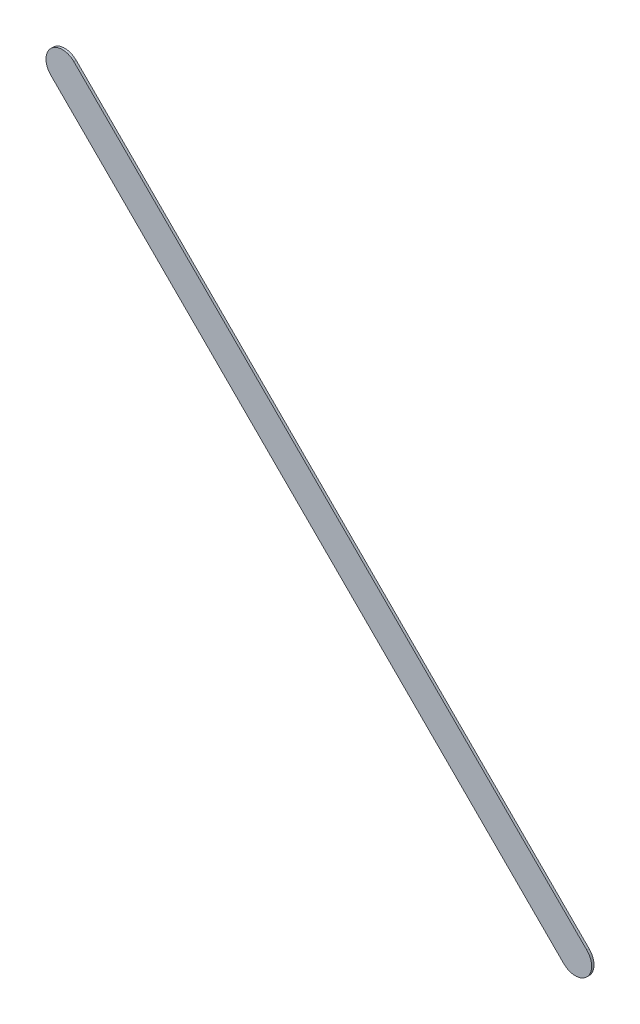
ISO-10303-21;
HEADER;
FILE_DESCRIPTION(('STEP AP214'),'2;1');
FILE_NAME('part.step','',(''),(''),'','','');
FILE_SCHEMA(('AUTOMOTIVE_DESIGN { 1 0 10303 214 1 1 1 1 }'));
ENDSEC;
DATA;
#1=APPLICATION_CONTEXT('core data for automotive mechanical design processes');
#2=APPLICATION_PROTOCOL_DEFINITION('international standard','automotive_design',2000,#1);
#3=PRODUCT_CONTEXT('',#1,'mechanical');
#4=PRODUCT('Part','Part','',(#3));
#5=PRODUCT_RELATED_PRODUCT_CATEGORY('part','',(#4));
#6=PRODUCT_DEFINITION_FORMATION('','',#4);
#7=PRODUCT_DEFINITION_CONTEXT('part definition',#1,'design');
#8=PRODUCT_DEFINITION('design','',#6,#7);
#9=PRODUCT_DEFINITION_SHAPE('','',#8);
#10=(LENGTH_UNIT() NAMED_UNIT(*) SI_UNIT(.MILLI.,.METRE.));
#11=(NAMED_UNIT(*) PLANE_ANGLE_UNIT() SI_UNIT($,.RADIAN.));
#12=(NAMED_UNIT(*) SI_UNIT($,.STERADIAN.) SOLID_ANGLE_UNIT());
#13=UNCERTAINTY_MEASURE_WITH_UNIT(LENGTH_MEASURE(1.E-05),#10,'distance_accuracy_value','');
#14=(GEOMETRIC_REPRESENTATION_CONTEXT(3) GLOBAL_UNCERTAINTY_ASSIGNED_CONTEXT((#13)) GLOBAL_UNIT_ASSIGNED_CONTEXT((#10,
#11,#12)) REPRESENTATION_CONTEXT('',''));
#15=CARTESIAN_POINT('',(0.,0.,0.));
#16=DIRECTION('',(0.,0.,1.));
#17=DIRECTION('',(1.,0.,0.));
#18=AXIS2_PLACEMENT_3D('',#15,#16,#17);
#19=CARTESIAN_POINT('',(62.39256762,82.15386922,0.));
#20=DIRECTION('',(0.707106781186548,0.707106781186547,0.));
#21=DIRECTION('',(0.707106781186547,-0.707106781186548,0.));
#22=AXIS2_PLACEMENT_3D('',#19,#20,#21);
#23=PLANE('',#22);
#24=DIRECTION('',(0.707106781186547,-0.707106781186548,0.));
#25=VECTOR('',#24,1.);
#26=CARTESIAN_POINT('',(62.39256762,82.15386922,0.03556));
#27=LINE('',#26,#25);
#28=CARTESIAN_POINT('',(62.39256762,82.15386922,0.03556));
#29=VERTEX_POINT('',#28);
#30=CARTESIAN_POINT('',(70.22322252,74.32321432,0.03556));
#31=VERTEX_POINT('',#30);
#32=EDGE_CURVE('E11',#29,#31,#27,.T.);
#33=ORIENTED_EDGE('',*,*,#32,.F.);
#34=DIRECTION('',(0.,0.,1.));
#35=VECTOR('',#34,1.);
#36=CARTESIAN_POINT('',(62.39256762,82.15386922,0.));
#37=LINE('',#36,#35);
#38=CARTESIAN_POINT('',(62.39256762,82.15386922,0.));
#39=VERTEX_POINT('',#38);
#40=EDGE_CURVE('E24',#39,#29,#37,.T.);
#41=ORIENTED_EDGE('',*,*,#40,.F.);
#42=DIRECTION('',(0.707106781186547,-0.707106781186548,0.));
#43=VECTOR('',#42,1.);
#44=CARTESIAN_POINT('',(62.39256762,82.15386922,0.));
#45=LINE('',#44,#43);
#46=CARTESIAN_POINT('',(70.22322252,74.32321432,0.));
#47=VERTEX_POINT('',#46);
#48=EDGE_CURVE('E75',#39,#47,#45,.T.);
#49=ORIENTED_EDGE('',*,*,#48,.T.);
#50=DIRECTION('',(0.,0.,1.));
#51=VECTOR('',#50,1.);
#52=CARTESIAN_POINT('',(70.22322252,74.32321432,0.));
#53=LINE('',#52,#51);
#54=EDGE_CURVE('E37',#47,#31,#53,.T.);
#55=ORIENTED_EDGE('',*,*,#54,.T.);
#56=EDGE_LOOP('',(#33,#41,#49,#55));
#57=FACE_BOUND('',#56,.T.);
#58=ADVANCED_FACE('F17',(#57),#23,.F.);
#59=CARTESIAN_POINT('',(70.3999989,74.4999907,0.));
#60=DIRECTION('',(0.,0.,-1.));
#61=DIRECTION('',(-0.707106781186576,-0.707106781186519,0.));
#62=AXIS2_PLACEMENT_3D('',#59,#60,#61);
#63=CYLINDRICAL_SURFACE('',#62,0.249999554103223);
#64=CARTESIAN_POINT('',(70.3999989,74.4999907,0.03556));
#65=DIRECTION('',(0.,0.,1.));
#66=DIRECTION('',(-0.707106781186576,-0.707106781186519,0.));
#67=AXIS2_PLACEMENT_3D('',#64,#65,#66);
#68=CIRCLE('',#67,0.249999554103223);
#69=CARTESIAN_POINT('',(70.57677528,74.67676708,0.03556));
#70=VERTEX_POINT('',#69);
#71=EDGE_CURVE('E83',#31,#70,#68,.T.);
#72=ORIENTED_EDGE('',*,*,#71,.F.);
#73=ORIENTED_EDGE('',*,*,#54,.F.);
#74=CARTESIAN_POINT('',(70.3999989,74.4999907,0.));
#75=DIRECTION('',(0.,0.,1.));
#76=DIRECTION('',(-0.707106781186576,-0.707106781186519,0.));
#77=AXIS2_PLACEMENT_3D('',#74,#75,#76);
#78=CIRCLE('',#77,0.249999554103223);
#79=CARTESIAN_POINT('',(70.57677528,74.67676708,0.));
#80=VERTEX_POINT('',#79);
#81=EDGE_CURVE('E81',#47,#80,#78,.T.);
#82=ORIENTED_EDGE('',*,*,#81,.T.);
#83=DIRECTION('',(0.,0.,1.));
#84=VECTOR('',#83,1.);
#85=CARTESIAN_POINT('',(70.57677528,74.67676708,0.));
#86=LINE('',#85,#84);
#87=EDGE_CURVE('E67',#80,#70,#86,.T.);
#88=ORIENTED_EDGE('',*,*,#87,.T.);
#89=EDGE_LOOP('',(#72,#73,#82,#88));
#90=FACE_BOUND('',#89,.T.);
#91=ADVANCED_FACE('F89',(#90),#63,.T.);
#92=CARTESIAN_POINT('',(70.57677528,74.67676708,0.));
#93=DIRECTION('',(-0.707106781186547,-0.707106781186548,0.));
#94=DIRECTION('',(-0.707106781186548,0.707106781186547,0.));
#95=AXIS2_PLACEMENT_3D('',#92,#93,#94);
#96=PLANE('',#95);
#97=DIRECTION('',(-0.707106781186548,0.707106781186547,0.));
#98=VECTOR('',#97,1.);
#99=CARTESIAN_POINT('',(70.57677528,74.67676708,0.03556));
#100=LINE('',#99,#98);
#101=CARTESIAN_POINT('',(62.74612038,82.50742198,0.03556));
#102=VERTEX_POINT('',#101);
#103=EDGE_CURVE('E71',#70,#102,#100,.T.);
#104=ORIENTED_EDGE('',*,*,#103,.F.);
#105=ORIENTED_EDGE('',*,*,#87,.F.);
#106=DIRECTION('',(-0.707106781186548,0.707106781186547,0.));
#107=VECTOR('',#106,1.);
#108=CARTESIAN_POINT('',(70.57677528,74.67676708,0.));
#109=LINE('',#108,#107);
#110=CARTESIAN_POINT('',(62.74612038,82.50742198,0.));
#111=VERTEX_POINT('',#110);
#112=EDGE_CURVE('E63',#80,#111,#109,.T.);
#113=ORIENTED_EDGE('',*,*,#112,.T.);
#114=DIRECTION('',(0.,0.,1.));
#115=VECTOR('',#114,1.);
#116=CARTESIAN_POINT('',(62.74612038,82.50742198,0.));
#117=LINE('',#116,#115);
#118=EDGE_CURVE('E53',#111,#102,#117,.T.);
#119=ORIENTED_EDGE('',*,*,#118,.T.);
#120=EDGE_LOOP('',(#104,#105,#113,#119));
#121=FACE_BOUND('',#120,.T.);
#122=ADVANCED_FACE('F66',(#121),#96,.F.);
#123=CARTESIAN_POINT('',(62.569344,82.3306456,0.));
#124=DIRECTION('',(0.,0.,-1.));
#125=DIRECTION('',(0.707106781186562,0.707106781186533,0.));
#126=AXIS2_PLACEMENT_3D('',#123,#124,#125);
#127=CYLINDRICAL_SURFACE('',#126,0.249999554103218);
#128=CARTESIAN_POINT('',(62.569344,82.3306456,0.03556));
#129=DIRECTION('',(0.,0.,1.));
#130=DIRECTION('',(0.707106781186562,0.707106781186533,0.));
#131=AXIS2_PLACEMENT_3D('',#128,#129,#130);
#132=CIRCLE('',#131,0.249999554103218);
#133=EDGE_CURVE('E59',#102,#29,#132,.T.);
#134=ORIENTED_EDGE('',*,*,#133,.F.);
#135=ORIENTED_EDGE('',*,*,#118,.F.);
#136=CARTESIAN_POINT('',(62.569344,82.3306456,0.));
#137=DIRECTION('',(0.,0.,1.));
#138=DIRECTION('',(0.707106781186562,0.707106781186533,0.));
#139=AXIS2_PLACEMENT_3D('',#136,#137,#138);
#140=CIRCLE('',#139,0.249999554103218);
#141=EDGE_CURVE('E57',#111,#39,#140,.T.);
#142=ORIENTED_EDGE('',*,*,#141,.T.);
#143=ORIENTED_EDGE('',*,*,#40,.T.);
#144=EDGE_LOOP('',(#134,#135,#142,#143));
#145=FACE_BOUND('',#144,.T.);
#146=ADVANCED_FACE('F55',(#145),#127,.T.);
#147=CARTESIAN_POINT('',(62.39256762,82.15386922,0.));
#148=DIRECTION('',(0.,0.,-1.));
#149=DIRECTION('',(-1.,0.,0.));
#150=AXIS2_PLACEMENT_3D('',#147,#148,#149);
#151=PLANE('',#150);
#152=ORIENTED_EDGE('',*,*,#141,.F.);
#153=ORIENTED_EDGE('',*,*,#112,.F.);
#154=ORIENTED_EDGE('',*,*,#81,.F.);
#155=ORIENTED_EDGE('',*,*,#48,.F.);
#156=EDGE_LOOP('',(#152,#153,#154,#155));
#157=FACE_BOUND('',#156,.T.);
#158=ADVANCED_FACE('F74',(#157),#151,.T.);
#159=CARTESIAN_POINT('',(62.39256762,82.15386922,0.03556));
#160=DIRECTION('',(0.,0.,-1.));
#161=DIRECTION('',(-1.,0.,0.));
#162=AXIS2_PLACEMENT_3D('',#159,#160,#161);
#163=PLANE('',#162);
#164=ORIENTED_EDGE('',*,*,#32,.T.);
#165=ORIENTED_EDGE('',*,*,#71,.T.);
#166=ORIENTED_EDGE('',*,*,#103,.T.);
#167=ORIENTED_EDGE('',*,*,#133,.T.);
#168=EDGE_LOOP('',(#164,#165,#166,#167));
#169=FACE_BOUND('',#168,.T.);
#170=ADVANCED_FACE('F91',(#169),#163,.F.);
#171=CLOSED_SHELL('',(#58,#91,#122,#146,#158,#170));
#172=MANIFOLD_SOLID_BREP('B1',#171);
#173=ADVANCED_BREP_SHAPE_REPRESENTATION('',(#18,#172),#14);
#174=SHAPE_DEFINITION_REPRESENTATION(#9,#173);
ENDSEC;
END-ISO-10303-21;
